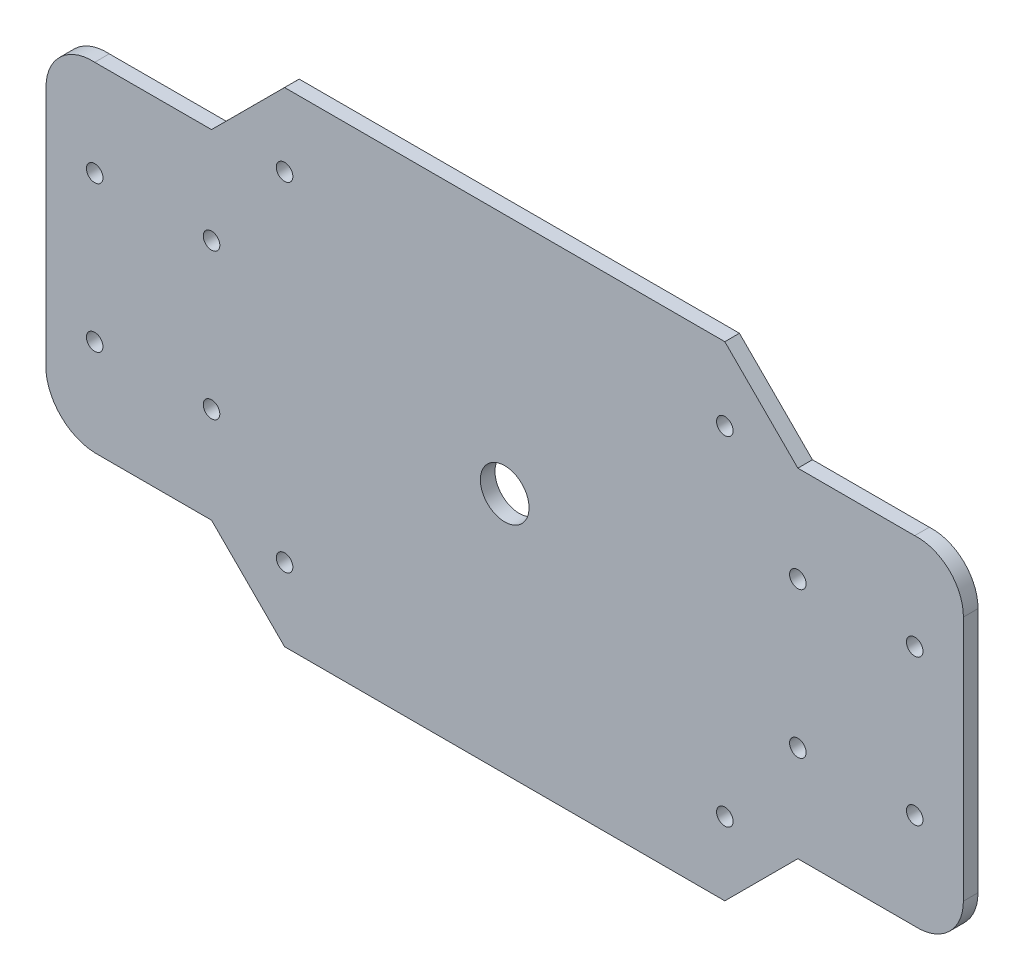
ISO-10303-21;
HEADER;
FILE_DESCRIPTION(('STEP AP214'),'2;1');
FILE_NAME('part.step','',(''),(''),'','','');
FILE_SCHEMA(('AUTOMOTIVE_DESIGN { 1 0 10303 214 1 1 1 1 }'));
ENDSEC;
DATA;
#1=APPLICATION_CONTEXT('core data for automotive mechanical design processes');
#2=APPLICATION_PROTOCOL_DEFINITION('international standard','automotive_design',2000,#1);
#3=PRODUCT_CONTEXT('',#1,'mechanical');
#4=PRODUCT('Part','Part','',(#3));
#5=PRODUCT_RELATED_PRODUCT_CATEGORY('part','',(#4));
#6=PRODUCT_DEFINITION_FORMATION('','',#4);
#7=PRODUCT_DEFINITION_CONTEXT('part definition',#1,'design');
#8=PRODUCT_DEFINITION('design','',#6,#7);
#9=PRODUCT_DEFINITION_SHAPE('','',#8);
#10=(LENGTH_UNIT() NAMED_UNIT(*) SI_UNIT(.MILLI.,.METRE.));
#11=(NAMED_UNIT(*) PLANE_ANGLE_UNIT() SI_UNIT($,.RADIAN.));
#12=(NAMED_UNIT(*) SI_UNIT($,.STERADIAN.) SOLID_ANGLE_UNIT());
#13=UNCERTAINTY_MEASURE_WITH_UNIT(LENGTH_MEASURE(1.E-05),#10,'distance_accuracy_value','');
#14=(GEOMETRIC_REPRESENTATION_CONTEXT(3) GLOBAL_UNCERTAINTY_ASSIGNED_CONTEXT((#13)) GLOBAL_UNIT_ASSIGNED_CONTEXT((#10,
#11,#12)) REPRESENTATION_CONTEXT('',''));
#15=CARTESIAN_POINT('',(0.,0.,0.));
#16=DIRECTION('',(0.,0.,1.));
#17=DIRECTION('',(1.,0.,0.));
#18=AXIS2_PLACEMENT_3D('',#15,#16,#17);
#19=CARTESIAN_POINT('',(-73.9609484041655,-51.1693996308529,3.));
#20=DIRECTION('',(0.,0.,1.));
#21=DIRECTION('',(1.,0.,0.));
#22=AXIS2_PLACEMENT_3D('',#19,#20,#21);
#23=PLANE('',#22);
#24=CARTESIAN_POINT('',(56.0129001992124,-111.19307287149,3.));
#25=DIRECTION('',(0.,0.,1.));
#26=DIRECTION('',(1.,0.,0.));
#27=AXIS2_PLACEMENT_3D('',#24,#25,#26);
#28=CIRCLE('',#27,1.70000000003746);
#29=CARTESIAN_POINT('',(57.7129001992499,-111.19307287149,3.));
#30=VERTEX_POINT('',#29);
#31=EDGE_CURVE('E379',#30,#30,#28,.T.);
#32=ORIENTED_EDGE('',*,*,#31,.F.);
#33=EDGE_LOOP('',(#32));
#34=FACE_BOUND('',#33,.T.);
#35=CARTESIAN_POINT('',(-34.4110998007876,-41.7240728714904,3.));
#36=DIRECTION('',(0.,0.,1.));
#37=DIRECTION('',(1.,0.,0.));
#38=AXIS2_PLACEMENT_3D('',#35,#36,#37);
#39=CIRCLE('',#38,1.70000000004367);
#40=CARTESIAN_POINT('',(-32.7110998007439,-41.7240728714904,3.));
#41=VERTEX_POINT('',#40);
#42=EDGE_CURVE('E391',#41,#41,#39,.T.);
#43=ORIENTED_EDGE('',*,*,#42,.F.);
#44=EDGE_LOOP('',(#43));
#45=FACE_BOUND('',#44,.T.);
#46=CARTESIAN_POINT('',(71.0129001992124,-61.4585728714904,3.));
#47=DIRECTION('',(0.,0.,1.));
#48=DIRECTION('',(1.,0.,0.));
#49=AXIS2_PLACEMENT_3D('',#46,#47,#48);
#50=CIRCLE('',#49,1.70000000003744);
#51=CARTESIAN_POINT('',(72.7129001992498,-61.4585728714904,3.));
#52=VERTEX_POINT('',#51);
#53=EDGE_CURVE('E403',#52,#52,#50,.T.);
#54=ORIENTED_EDGE('',*,*,#53,.F.);
#55=EDGE_LOOP('',(#54));
#56=FACE_BOUND('',#55,.T.);
#57=CARTESIAN_POINT('',(71.0129001992124,-91.4585728714904,3.));
#58=DIRECTION('',(0.,0.,1.));
#59=DIRECTION('',(1.,0.,0.));
#60=AXIS2_PLACEMENT_3D('',#57,#58,#59);
#61=CIRCLE('',#60,1.70000000003744);
#62=CARTESIAN_POINT('',(72.7129001992498,-91.4585728714904,3.));
#63=VERTEX_POINT('',#62);
#64=EDGE_CURVE('E415',#63,#63,#61,.T.);
#65=ORIENTED_EDGE('',*,*,#64,.F.);
#66=EDGE_LOOP('',(#65));
#67=FACE_BOUND('',#66,.T.);
#68=CARTESIAN_POINT('',(-49.4110998007876,-91.4585728714904,3.));
#69=DIRECTION('',(0.,0.,1.));
#70=DIRECTION('',(1.,0.,0.));
#71=AXIS2_PLACEMENT_3D('',#68,#69,#70);
#72=CIRCLE('',#71,1.70000000004368);
#73=CARTESIAN_POINT('',(-47.711099800744,-91.4585728714904,3.));
#74=VERTEX_POINT('',#73);
#75=EDGE_CURVE('E427',#74,#74,#72,.T.);
#76=ORIENTED_EDGE('',*,*,#75,.F.);
#77=EDGE_LOOP('',(#76));
#78=FACE_BOUND('',#77,.T.);
#79=CARTESIAN_POINT('',(-73.4110998007876,-61.4585728714903,3.));
#80=DIRECTION('',(0.,0.,1.));
#81=DIRECTION('',(1.,0.,0.));
#82=AXIS2_PLACEMENT_3D('',#79,#80,#81);
#83=CIRCLE('',#82,1.70000000004367);
#84=CARTESIAN_POINT('',(-71.7110998007439,-61.4585728714903,3.));
#85=VERTEX_POINT('',#84);
#86=EDGE_CURVE('E439',#85,#85,#83,.T.);
#87=ORIENTED_EDGE('',*,*,#86,.F.);
#88=EDGE_LOOP('',(#87));
#89=FACE_BOUND('',#88,.T.);
#90=CARTESIAN_POINT('',(-73.9609484041655,-51.1693996308529,3.));
#91=DIRECTION('',(0.,0.,1.));
#92=DIRECTION('',(1.,0.,0.));
#93=AXIS2_PLACEMENT_3D('',#90,#91,#92);
#94=CIRCLE('',#93,9.45015420591884);
#95=CARTESIAN_POINT('',(-73.4110998007876,-41.7352552059987,3.));
#96=VERTEX_POINT('',#95);
#97=CARTESIAN_POINT('',(-83.4110998007876,-51.1621128918068,3.));
#98=VERTEX_POINT('',#97);
#99=EDGE_CURVE('E209',#96,#98,#94,.T.);
#100=ORIENTED_EDGE('',*,*,#99,.T.);
#101=DIRECTION('',(0.,-1.,0.));
#102=VECTOR('',#101,1.);
#103=CARTESIAN_POINT('',(-83.4110998007876,-51.1621128918068,3.));
#104=LINE('',#103,#102);
#105=CARTESIAN_POINT('',(-83.4110998007876,-101.747816457124,3.));
#106=VERTEX_POINT('',#105);
#107=EDGE_CURVE('E117',#98,#106,#104,.T.);
#108=ORIENTED_EDGE('',*,*,#107,.T.);
#109=CARTESIAN_POINT('',(-72.9534173033831,-100.692218793061,3.));
#110=DIRECTION('',(0.,0.,1.));
#111=DIRECTION('',(1.,0.,0.));
#112=AXIS2_PLACEMENT_3D('',#109,#110,#111);
#113=CIRCLE('',#112,10.5108234522751);
#114=CARTESIAN_POINT('',(-73.4110998007876,-111.19307287149,3.));
#115=VERTEX_POINT('',#114);
#116=EDGE_CURVE('E248',#106,#115,#113,.T.);
#117=ORIENTED_EDGE('',*,*,#116,.T.);
#118=DIRECTION('',(1.,0.,0.));
#119=VECTOR('',#118,1.);
#120=CARTESIAN_POINT('',(-73.4110998007876,-111.19307287149,3.));
#121=LINE('',#120,#119);
#122=CARTESIAN_POINT('',(-49.4110998007876,-111.19307287149,3.));
#123=VERTEX_POINT('',#122);
#124=EDGE_CURVE('E267',#115,#123,#121,.T.);
#125=ORIENTED_EDGE('',*,*,#124,.T.);
#126=DIRECTION('',(0.707106781186547,-0.707106781186548,0.));
#127=VECTOR('',#126,1.);
#128=CARTESIAN_POINT('',(-49.4110998007876,-111.19307287149,3.));
#129=LINE('',#128,#127);
#130=CARTESIAN_POINT('',(-34.4110998007876,-126.19307287149,3.));
#131=VERTEX_POINT('',#130);
#132=EDGE_CURVE('E264',#123,#131,#129,.T.);
#133=ORIENTED_EDGE('',*,*,#132,.T.);
#134=DIRECTION('',(1.,0.,0.));
#135=VECTOR('',#134,1.);
#136=CARTESIAN_POINT('',(-34.4110998007876,-126.19307287149,3.));
#137=LINE('',#136,#135);
#138=CARTESIAN_POINT('',(56.0129001992124,-126.19307287149,3.));
#139=VERTEX_POINT('',#138);
#140=EDGE_CURVE('E266',#131,#139,#137,.T.);
#141=ORIENTED_EDGE('',*,*,#140,.T.);
#142=DIRECTION('',(0.707106781186547,0.707106781186548,0.));
#143=VECTOR('',#142,1.);
#144=CARTESIAN_POINT('',(56.0129001992124,-126.19307287149,3.));
#145=LINE('',#144,#143);
#146=CARTESIAN_POINT('',(71.0129001992124,-111.19307287149,3.));
#147=VERTEX_POINT('',#146);
#148=EDGE_CURVE('E269',#139,#147,#145,.T.);
#149=ORIENTED_EDGE('',*,*,#148,.T.);
#150=DIRECTION('',(1.,0.,0.));
#151=VECTOR('',#150,1.);
#152=CARTESIAN_POINT('',(71.0129001992124,-111.19307287149,3.));
#153=LINE('',#152,#151);
#154=CARTESIAN_POINT('',(95.0129001992124,-111.19307287149,3.));
#155=VERTEX_POINT('',#154);
#156=EDGE_CURVE('E275',#147,#155,#153,.T.);
#157=ORIENTED_EDGE('',*,*,#156,.T.);
#158=CARTESIAN_POINT('',(95.5591068848304,-101.758716890702,3.));
#159=DIRECTION('',(0.,0.,1.));
#160=DIRECTION('',(1.,0.,0.));
#161=AXIS2_PLACEMENT_3D('',#158,#159,#160);
#162=CIRCLE('',#161,9.45015420591886);
#163=CARTESIAN_POINT('',(105.009259778172,-101.753736115553,3.));
#164=VERTEX_POINT('',#163);
#165=EDGE_CURVE('E277',#155,#164,#162,.T.);
#166=ORIENTED_EDGE('',*,*,#165,.T.);
#167=DIRECTION('',(9.03448836990268E-05,0.999999995918901,0.));
#168=VECTOR('',#167,1.);
#169=CARTESIAN_POINT('',(105.013826090519,-51.2106157786757,3.));
#170=LINE('',#169,#168);
#171=CARTESIAN_POINT('',(105.013826090519,-51.2106157786757,3.));
#172=VERTEX_POINT('',#171);
#173=EDGE_CURVE('E279',#164,#172,#170,.T.);
#174=ORIENTED_EDGE('',*,*,#173,.T.);
#175=CARTESIAN_POINT('',(95.5638174991476,-51.1581549489518,3.));
#176=DIRECTION('',(0.,0.,1.));
#177=DIRECTION('',(1.,0.,0.));
#178=AXIS2_PLACEMENT_3D('',#175,#176,#177);
#179=CIRCLE('',#178,9.45015420591887);
#180=CARTESIAN_POINT('',(95.0129001992124,-41.7240728714904,3.));
#181=VERTEX_POINT('',#180);
#182=EDGE_CURVE('E281',#172,#181,#179,.T.);
#183=ORIENTED_EDGE('',*,*,#182,.T.);
#184=DIRECTION('',(-1.,0.,0.));
#185=VECTOR('',#184,1.);
#186=CARTESIAN_POINT('',(71.0129001992124,-41.7240728714904,3.));
#187=LINE('',#186,#185);
#188=CARTESIAN_POINT('',(71.0129001992124,-41.7240728714904,3.));
#189=VERTEX_POINT('',#188);
#190=EDGE_CURVE('E283',#181,#189,#187,.T.);
#191=ORIENTED_EDGE('',*,*,#190,.T.);
#192=DIRECTION('',(-0.707106781186548,0.707106781186547,0.));
#193=VECTOR('',#192,1.);
#194=CARTESIAN_POINT('',(56.0129001992124,-26.7240728714904,3.));
#195=LINE('',#194,#193);
#196=CARTESIAN_POINT('',(56.0129001992124,-26.7240728714904,3.));
#197=VERTEX_POINT('',#196);
#198=EDGE_CURVE('E160',#189,#197,#195,.T.);
#199=ORIENTED_EDGE('',*,*,#198,.T.);
#200=DIRECTION('',(-1.,0.,0.));
#201=VECTOR('',#200,1.);
#202=CARTESIAN_POINT('',(-34.4110998007876,-26.7240728714904,3.));
#203=LINE('',#202,#201);
#204=CARTESIAN_POINT('',(-34.4110998007876,-26.7240728714904,3.));
#205=VERTEX_POINT('',#204);
#206=EDGE_CURVE('E154',#197,#205,#203,.T.);
#207=ORIENTED_EDGE('',*,*,#206,.T.);
#208=DIRECTION('',(-0.707370400442388,-0.706843063613116,0.));
#209=VECTOR('',#208,1.);
#210=CARTESIAN_POINT('',(-49.4110998007876,-41.712890536982,3.));
#211=LINE('',#210,#209);
#212=CARTESIAN_POINT('',(-49.4110998007876,-41.712890536982,3.));
#213=VERTEX_POINT('',#212);
#214=EDGE_CURVE('E158',#205,#213,#211,.T.);
#215=ORIENTED_EDGE('',*,*,#214,.T.);
#216=DIRECTION('',(-0.999999565817626,-0.000931860804429724,0.));
#217=VECTOR('',#216,1.);
#218=CARTESIAN_POINT('',(-73.4110998007876,-41.7352552059987,3.));
#219=LINE('',#218,#217);
#220=EDGE_CURVE('E50',#213,#96,#219,.T.);
#221=ORIENTED_EDGE('',*,*,#220,.T.);
#222=EDGE_LOOP('',(#100,#108,#117,#125,#133,#141,#149,#157,#166,#174,#183,#191,#199,#207,#215,#221));
#223=FACE_BOUND('',#222,.T.);
#224=CARTESIAN_POINT('',(-49.4110998007876,-61.4585728714904,3.));
#225=DIRECTION('',(0.,0.,1.));
#226=DIRECTION('',(1.,0.,0.));
#227=AXIS2_PLACEMENT_3D('',#224,#225,#226);
#228=CIRCLE('',#227,1.7000000000437);
#229=CARTESIAN_POINT('',(-47.7110998007439,-61.4585728714904,3.));
#230=VERTEX_POINT('',#229);
#231=EDGE_CURVE('E182',#230,#230,#228,.T.);
#232=ORIENTED_EDGE('',*,*,#231,.F.);
#233=EDGE_LOOP('',(#232));
#234=FACE_BOUND('',#233,.T.);
#235=CARTESIAN_POINT('',(-73.4110998007876,-91.4585728714904,3.));
#236=DIRECTION('',(0.,0.,1.));
#237=DIRECTION('',(1.,0.,0.));
#238=AXIS2_PLACEMENT_3D('',#235,#236,#237);
#239=CIRCLE('',#238,1.70000000004367);
#240=CARTESIAN_POINT('',(-71.711099800744,-91.4585728714904,3.));
#241=VERTEX_POINT('',#240);
#242=EDGE_CURVE('E433',#241,#241,#239,.T.);
#243=ORIENTED_EDGE('',*,*,#242,.F.);
#244=EDGE_LOOP('',(#243));
#245=FACE_BOUND('',#244,.T.);
#246=CARTESIAN_POINT('',(95.0129001992124,-91.4585728714904,3.));
#247=DIRECTION('',(0.,0.,1.));
#248=DIRECTION('',(1.,0.,0.));
#249=AXIS2_PLACEMENT_3D('',#246,#247,#248);
#250=CIRCLE('',#249,1.70000000003744);
#251=CARTESIAN_POINT('',(96.7129001992498,-91.4585728714904,3.));
#252=VERTEX_POINT('',#251);
#253=EDGE_CURVE('E421',#252,#252,#250,.T.);
#254=ORIENTED_EDGE('',*,*,#253,.F.);
#255=EDGE_LOOP('',(#254));
#256=FACE_BOUND('',#255,.T.);
#257=CARTESIAN_POINT('',(95.0129001992124,-61.4585728714904,3.));
#258=DIRECTION('',(0.,0.,1.));
#259=DIRECTION('',(1.,0.,0.));
#260=AXIS2_PLACEMENT_3D('',#257,#258,#259);
#261=CIRCLE('',#260,1.70000000003744);
#262=CARTESIAN_POINT('',(96.7129001992498,-61.4585728714904,3.));
#263=VERTEX_POINT('',#262);
#264=EDGE_CURVE('E409',#263,#263,#261,.T.);
#265=ORIENTED_EDGE('',*,*,#264,.F.);
#266=EDGE_LOOP('',(#265));
#267=FACE_BOUND('',#266,.T.);
#268=CARTESIAN_POINT('',(10.8009001992124,-76.3830420823452,3.));
#269=DIRECTION('',(0.,0.,1.));
#270=DIRECTION('',(1.,0.,0.));
#271=AXIS2_PLACEMENT_3D('',#268,#269,#270);
#272=CIRCLE('',#271,5.00000000001872);
#273=CARTESIAN_POINT('',(15.8009001992311,-76.3830420823452,3.));
#274=VERTEX_POINT('',#273);
#275=EDGE_CURVE('E397',#274,#274,#272,.T.);
#276=ORIENTED_EDGE('',*,*,#275,.F.);
#277=EDGE_LOOP('',(#276));
#278=FACE_BOUND('',#277,.T.);
#279=CARTESIAN_POINT('',(-34.4110998007876,-111.19307287149,3.));
#280=DIRECTION('',(0.,0.,1.));
#281=DIRECTION('',(1.,0.,0.));
#282=AXIS2_PLACEMENT_3D('',#279,#280,#281);
#283=CIRCLE('',#282,1.70000000003746);
#284=CARTESIAN_POINT('',(-32.7110998007501,-111.19307287149,3.));
#285=VERTEX_POINT('',#284);
#286=EDGE_CURVE('E385',#285,#285,#283,.T.);
#287=ORIENTED_EDGE('',*,*,#286,.F.);
#288=EDGE_LOOP('',(#287));
#289=FACE_BOUND('',#288,.T.);
#290=CARTESIAN_POINT('',(56.0129001992124,-41.7240728714904,3.));
#291=DIRECTION('',(0.,0.,1.));
#292=DIRECTION('',(1.,0.,0.));
#293=AXIS2_PLACEMENT_3D('',#290,#291,#292);
#294=CIRCLE('',#293,1.70000000004366);
#295=CARTESIAN_POINT('',(57.7129001992561,-41.7240728714904,3.));
#296=VERTEX_POINT('',#295);
#297=EDGE_CURVE('E370',#296,#296,#294,.T.);
#298=ORIENTED_EDGE('',*,*,#297,.F.);
#299=EDGE_LOOP('',(#298));
#300=FACE_BOUND('',#299,.T.);
#301=ADVANCED_FACE('F33',(#34,#45,#56,#67,#78,#89,#223,#234,#245,#256,#267,#278,#289,#300),#23,.T.);
#302=CARTESIAN_POINT('',(-73.9609484041655,-51.1693996308529,0.));
#303=DIRECTION('',(0.,0.,1.));
#304=DIRECTION('',(1.,0.,0.));
#305=AXIS2_PLACEMENT_3D('',#302,#303,#304);
#306=PLANE('',#305);
#307=CARTESIAN_POINT('',(-73.9609484041655,-51.1693996308529,0.));
#308=DIRECTION('',(0.,0.,1.));
#309=DIRECTION('',(1.,0.,0.));
#310=AXIS2_PLACEMENT_3D('',#307,#308,#309);
#311=CIRCLE('',#310,9.45015420591884);
#312=CARTESIAN_POINT('',(-73.4110998007876,-41.7352552059987,0.));
#313=VERTEX_POINT('',#312);
#314=CARTESIAN_POINT('',(-83.4110998007876,-51.1621128918068,0.));
#315=VERTEX_POINT('',#314);
#316=EDGE_CURVE('E178',#313,#315,#311,.T.);
#317=ORIENTED_EDGE('',*,*,#316,.F.);
#318=DIRECTION('',(-0.999999565817626,-0.000931860804429724,0.));
#319=VECTOR('',#318,1.);
#320=CARTESIAN_POINT('',(-73.4110998007876,-41.7352552059987,0.));
#321=LINE('',#320,#319);
#322=CARTESIAN_POINT('',(-49.4110998007876,-41.712890536982,0.));
#323=VERTEX_POINT('',#322);
#324=EDGE_CURVE('E109',#323,#313,#321,.T.);
#325=ORIENTED_EDGE('',*,*,#324,.F.);
#326=DIRECTION('',(-0.707370400442388,-0.706843063613116,0.));
#327=VECTOR('',#326,1.);
#328=CARTESIAN_POINT('',(-49.4110998007876,-41.712890536982,0.));
#329=LINE('',#328,#327);
#330=CARTESIAN_POINT('',(-34.4110998007876,-26.7240728714904,0.));
#331=VERTEX_POINT('',#330);
#332=EDGE_CURVE('E103',#331,#323,#329,.T.);
#333=ORIENTED_EDGE('',*,*,#332,.F.);
#334=DIRECTION('',(-1.,0.,0.));
#335=VECTOR('',#334,1.);
#336=CARTESIAN_POINT('',(-34.4110998007876,-26.7240728714904,0.));
#337=LINE('',#336,#335);
#338=CARTESIAN_POINT('',(56.0129001992124,-26.7240728714904,0.));
#339=VERTEX_POINT('',#338);
#340=EDGE_CURVE('E168',#339,#331,#337,.T.);
#341=ORIENTED_EDGE('',*,*,#340,.F.);
#342=DIRECTION('',(-0.707106781186548,0.707106781186547,0.));
#343=VECTOR('',#342,1.);
#344=CARTESIAN_POINT('',(56.0129001992124,-26.7240728714904,0.));
#345=LINE('',#344,#343);
#346=CARTESIAN_POINT('',(71.0129001992124,-41.7240728714904,0.));
#347=VERTEX_POINT('',#346);
#348=EDGE_CURVE('E204',#347,#339,#345,.T.);
#349=ORIENTED_EDGE('',*,*,#348,.F.);
#350=DIRECTION('',(-1.,0.,0.));
#351=VECTOR('',#350,1.);
#352=CARTESIAN_POINT('',(71.0129001992124,-41.7240728714904,0.));
#353=LINE('',#352,#351);
#354=CARTESIAN_POINT('',(95.0129001992124,-41.7240728714904,0.));
#355=VERTEX_POINT('',#354);
#356=EDGE_CURVE('E202',#355,#347,#353,.T.);
#357=ORIENTED_EDGE('',*,*,#356,.F.);
#358=CARTESIAN_POINT('',(95.5638174991476,-51.1581549489518,0.));
#359=DIRECTION('',(0.,0.,1.));
#360=DIRECTION('',(1.,0.,0.));
#361=AXIS2_PLACEMENT_3D('',#358,#359,#360);
#362=CIRCLE('',#361,9.45015420591887);
#363=CARTESIAN_POINT('',(105.013826090519,-51.2106157786757,0.));
#364=VERTEX_POINT('',#363);
#365=EDGE_CURVE('E200',#364,#355,#362,.T.);
#366=ORIENTED_EDGE('',*,*,#365,.F.);
#367=DIRECTION('',(9.03448836990268E-05,0.999999995918901,0.));
#368=VECTOR('',#367,1.);
#369=CARTESIAN_POINT('',(105.013826090519,-51.2106157786757,0.));
#370=LINE('',#369,#368);
#371=CARTESIAN_POINT('',(105.009259778172,-101.753736115553,0.));
#372=VERTEX_POINT('',#371);
#373=EDGE_CURVE('E198',#372,#364,#370,.T.);
#374=ORIENTED_EDGE('',*,*,#373,.F.);
#375=CARTESIAN_POINT('',(95.5591068848304,-101.758716890702,0.));
#376=DIRECTION('',(0.,0.,1.));
#377=DIRECTION('',(1.,0.,0.));
#378=AXIS2_PLACEMENT_3D('',#375,#376,#377);
#379=CIRCLE('',#378,9.45015420591886);
#380=CARTESIAN_POINT('',(95.0129001992124,-111.19307287149,0.));
#381=VERTEX_POINT('',#380);
#382=EDGE_CURVE('E196',#381,#372,#379,.T.);
#383=ORIENTED_EDGE('',*,*,#382,.F.);
#384=DIRECTION('',(1.,0.,0.));
#385=VECTOR('',#384,1.);
#386=CARTESIAN_POINT('',(71.0129001992124,-111.19307287149,0.));
#387=LINE('',#386,#385);
#388=CARTESIAN_POINT('',(71.0129001992124,-111.19307287149,0.));
#389=VERTEX_POINT('',#388);
#390=EDGE_CURVE('E194',#389,#381,#387,.T.);
#391=ORIENTED_EDGE('',*,*,#390,.F.);
#392=DIRECTION('',(0.707106781186547,0.707106781186548,0.));
#393=VECTOR('',#392,1.);
#394=CARTESIAN_POINT('',(56.0129001992124,-126.19307287149,0.));
#395=LINE('',#394,#393);
#396=CARTESIAN_POINT('',(56.0129001992124,-126.19307287149,0.));
#397=VERTEX_POINT('',#396);
#398=EDGE_CURVE('E192',#397,#389,#395,.T.);
#399=ORIENTED_EDGE('',*,*,#398,.F.);
#400=DIRECTION('',(1.,0.,0.));
#401=VECTOR('',#400,1.);
#402=CARTESIAN_POINT('',(-34.4110998007876,-126.19307287149,0.));
#403=LINE('',#402,#401);
#404=CARTESIAN_POINT('',(-34.4110998007876,-126.19307287149,0.));
#405=VERTEX_POINT('',#404);
#406=EDGE_CURVE('E190',#405,#397,#403,.T.);
#407=ORIENTED_EDGE('',*,*,#406,.F.);
#408=DIRECTION('',(0.707106781186547,-0.707106781186548,0.));
#409=VECTOR('',#408,1.);
#410=CARTESIAN_POINT('',(-49.4110998007876,-111.19307287149,0.));
#411=LINE('',#410,#409);
#412=CARTESIAN_POINT('',(-49.4110998007876,-111.19307287149,0.));
#413=VERTEX_POINT('',#412);
#414=EDGE_CURVE('E188',#413,#405,#411,.T.);
#415=ORIENTED_EDGE('',*,*,#414,.F.);
#416=DIRECTION('',(1.,0.,0.));
#417=VECTOR('',#416,1.);
#418=CARTESIAN_POINT('',(-73.4110998007876,-111.19307287149,0.));
#419=LINE('',#418,#417);
#420=CARTESIAN_POINT('',(-73.4110998007876,-111.19307287149,0.));
#421=VERTEX_POINT('',#420);
#422=EDGE_CURVE('E186',#421,#413,#419,.T.);
#423=ORIENTED_EDGE('',*,*,#422,.F.);
#424=CARTESIAN_POINT('',(-72.9534173033831,-100.692218793061,0.));
#425=DIRECTION('',(0.,0.,1.));
#426=DIRECTION('',(1.,0.,0.));
#427=AXIS2_PLACEMENT_3D('',#424,#425,#426);
#428=CIRCLE('',#427,10.5108234522751);
#429=CARTESIAN_POINT('',(-83.4110998007876,-101.747816457124,0.));
#430=VERTEX_POINT('',#429);
#431=EDGE_CURVE('E184',#430,#421,#428,.T.);
#432=ORIENTED_EDGE('',*,*,#431,.F.);
#433=DIRECTION('',(0.,-1.,0.));
#434=VECTOR('',#433,1.);
#435=CARTESIAN_POINT('',(-83.4110998007876,-51.1621128918068,0.));
#436=LINE('',#435,#434);
#437=EDGE_CURVE('E181',#315,#430,#436,.T.);
#438=ORIENTED_EDGE('',*,*,#437,.F.);
#439=EDGE_LOOP('',(#317,#325,#333,#341,#349,#357,#366,#374,#383,#391,#399,#407,#415,#423,#432,#438));
#440=FACE_BOUND('',#439,.T.);
#441=CARTESIAN_POINT('',(-49.4110998007876,-61.4585728714904,0.));
#442=DIRECTION('',(0.,0.,1.));
#443=DIRECTION('',(1.,0.,0.));
#444=AXIS2_PLACEMENT_3D('',#441,#442,#443);
#445=CIRCLE('',#444,1.7000000000437);
#446=CARTESIAN_POINT('',(-47.7110998007439,-61.4585728714904,0.));
#447=VERTEX_POINT('',#446);
#448=EDGE_CURVE('E442',#447,#447,#445,.T.);
#449=ORIENTED_EDGE('',*,*,#448,.T.);
#450=EDGE_LOOP('',(#449));
#451=FACE_BOUND('',#450,.T.);
#452=CARTESIAN_POINT('',(-73.4110998007876,-61.4585728714903,0.));
#453=DIRECTION('',(0.,0.,1.));
#454=DIRECTION('',(1.,0.,0.));
#455=AXIS2_PLACEMENT_3D('',#452,#453,#454);
#456=CIRCLE('',#455,1.70000000004367);
#457=CARTESIAN_POINT('',(-71.7110998007439,-61.4585728714903,0.));
#458=VERTEX_POINT('',#457);
#459=EDGE_CURVE('E436',#458,#458,#456,.T.);
#460=ORIENTED_EDGE('',*,*,#459,.T.);
#461=EDGE_LOOP('',(#460));
#462=FACE_BOUND('',#461,.T.);
#463=CARTESIAN_POINT('',(-73.4110998007876,-91.4585728714904,0.));
#464=DIRECTION('',(0.,0.,1.));
#465=DIRECTION('',(1.,0.,0.));
#466=AXIS2_PLACEMENT_3D('',#463,#464,#465);
#467=CIRCLE('',#466,1.70000000004367);
#468=CARTESIAN_POINT('',(-71.711099800744,-91.4585728714904,0.));
#469=VERTEX_POINT('',#468);
#470=EDGE_CURVE('E430',#469,#469,#467,.T.);
#471=ORIENTED_EDGE('',*,*,#470,.T.);
#472=EDGE_LOOP('',(#471));
#473=FACE_BOUND('',#472,.T.);
#474=CARTESIAN_POINT('',(-49.4110998007876,-91.4585728714904,0.));
#475=DIRECTION('',(0.,0.,1.));
#476=DIRECTION('',(1.,0.,0.));
#477=AXIS2_PLACEMENT_3D('',#474,#475,#476);
#478=CIRCLE('',#477,1.70000000004368);
#479=CARTESIAN_POINT('',(-47.711099800744,-91.4585728714904,0.));
#480=VERTEX_POINT('',#479);
#481=EDGE_CURVE('E424',#480,#480,#478,.T.);
#482=ORIENTED_EDGE('',*,*,#481,.T.);
#483=EDGE_LOOP('',(#482));
#484=FACE_BOUND('',#483,.T.);
#485=CARTESIAN_POINT('',(95.0129001992124,-91.4585728714904,0.));
#486=DIRECTION('',(0.,0.,1.));
#487=DIRECTION('',(1.,0.,0.));
#488=AXIS2_PLACEMENT_3D('',#485,#486,#487);
#489=CIRCLE('',#488,1.70000000003744);
#490=CARTESIAN_POINT('',(96.7129001992498,-91.4585728714904,0.));
#491=VERTEX_POINT('',#490);
#492=EDGE_CURVE('E418',#491,#491,#489,.T.);
#493=ORIENTED_EDGE('',*,*,#492,.T.);
#494=EDGE_LOOP('',(#493));
#495=FACE_BOUND('',#494,.T.);
#496=CARTESIAN_POINT('',(71.0129001992124,-91.4585728714904,0.));
#497=DIRECTION('',(0.,0.,1.));
#498=DIRECTION('',(1.,0.,0.));
#499=AXIS2_PLACEMENT_3D('',#496,#497,#498);
#500=CIRCLE('',#499,1.70000000003744);
#501=CARTESIAN_POINT('',(72.7129001992498,-91.4585728714904,0.));
#502=VERTEX_POINT('',#501);
#503=EDGE_CURVE('E412',#502,#502,#500,.T.);
#504=ORIENTED_EDGE('',*,*,#503,.T.);
#505=EDGE_LOOP('',(#504));
#506=FACE_BOUND('',#505,.T.);
#507=CARTESIAN_POINT('',(95.0129001992124,-61.4585728714904,0.));
#508=DIRECTION('',(0.,0.,1.));
#509=DIRECTION('',(1.,0.,0.));
#510=AXIS2_PLACEMENT_3D('',#507,#508,#509);
#511=CIRCLE('',#510,1.70000000003744);
#512=CARTESIAN_POINT('',(96.7129001992498,-61.4585728714904,0.));
#513=VERTEX_POINT('',#512);
#514=EDGE_CURVE('E406',#513,#513,#511,.T.);
#515=ORIENTED_EDGE('',*,*,#514,.T.);
#516=EDGE_LOOP('',(#515));
#517=FACE_BOUND('',#516,.T.);
#518=CARTESIAN_POINT('',(71.0129001992124,-61.4585728714904,0.));
#519=DIRECTION('',(0.,0.,1.));
#520=DIRECTION('',(1.,0.,0.));
#521=AXIS2_PLACEMENT_3D('',#518,#519,#520);
#522=CIRCLE('',#521,1.70000000003744);
#523=CARTESIAN_POINT('',(72.7129001992498,-61.4585728714904,0.));
#524=VERTEX_POINT('',#523);
#525=EDGE_CURVE('E400',#524,#524,#522,.T.);
#526=ORIENTED_EDGE('',*,*,#525,.T.);
#527=EDGE_LOOP('',(#526));
#528=FACE_BOUND('',#527,.T.);
#529=CARTESIAN_POINT('',(10.8009001992124,-76.3830420823452,0.));
#530=DIRECTION('',(0.,0.,1.));
#531=DIRECTION('',(1.,0.,0.));
#532=AXIS2_PLACEMENT_3D('',#529,#530,#531);
#533=CIRCLE('',#532,5.00000000001872);
#534=CARTESIAN_POINT('',(15.8009001992311,-76.3830420823452,0.));
#535=VERTEX_POINT('',#534);
#536=EDGE_CURVE('E394',#535,#535,#533,.T.);
#537=ORIENTED_EDGE('',*,*,#536,.T.);
#538=EDGE_LOOP('',(#537));
#539=FACE_BOUND('',#538,.T.);
#540=CARTESIAN_POINT('',(-34.4110998007876,-41.7240728714904,0.));
#541=DIRECTION('',(0.,0.,1.));
#542=DIRECTION('',(1.,0.,0.));
#543=AXIS2_PLACEMENT_3D('',#540,#541,#542);
#544=CIRCLE('',#543,1.70000000004367);
#545=CARTESIAN_POINT('',(-32.7110998007439,-41.7240728714904,0.));
#546=VERTEX_POINT('',#545);
#547=EDGE_CURVE('E388',#546,#546,#544,.T.);
#548=ORIENTED_EDGE('',*,*,#547,.T.);
#549=EDGE_LOOP('',(#548));
#550=FACE_BOUND('',#549,.T.);
#551=CARTESIAN_POINT('',(-34.4110998007876,-111.19307287149,0.));
#552=DIRECTION('',(0.,0.,1.));
#553=DIRECTION('',(1.,0.,0.));
#554=AXIS2_PLACEMENT_3D('',#551,#552,#553);
#555=CIRCLE('',#554,1.70000000003746);
#556=CARTESIAN_POINT('',(-32.7110998007501,-111.19307287149,0.));
#557=VERTEX_POINT('',#556);
#558=EDGE_CURVE('E382',#557,#557,#555,.T.);
#559=ORIENTED_EDGE('',*,*,#558,.T.);
#560=EDGE_LOOP('',(#559));
#561=FACE_BOUND('',#560,.T.);
#562=CARTESIAN_POINT('',(56.0129001992124,-111.19307287149,0.));
#563=DIRECTION('',(0.,0.,1.));
#564=DIRECTION('',(1.,0.,0.));
#565=AXIS2_PLACEMENT_3D('',#562,#563,#564);
#566=CIRCLE('',#565,1.70000000003746);
#567=CARTESIAN_POINT('',(57.7129001992499,-111.19307287149,0.));
#568=VERTEX_POINT('',#567);
#569=EDGE_CURVE('E376',#568,#568,#566,.T.);
#570=ORIENTED_EDGE('',*,*,#569,.T.);
#571=EDGE_LOOP('',(#570));
#572=FACE_BOUND('',#571,.T.);
#573=CARTESIAN_POINT('',(56.0129001992124,-41.7240728714904,0.));
#574=DIRECTION('',(0.,0.,1.));
#575=DIRECTION('',(1.,0.,0.));
#576=AXIS2_PLACEMENT_3D('',#573,#574,#575);
#577=CIRCLE('',#576,1.70000000004366);
#578=CARTESIAN_POINT('',(57.7129001992561,-41.7240728714904,0.));
#579=VERTEX_POINT('',#578);
#580=EDGE_CURVE('E373',#579,#579,#577,.T.);
#581=ORIENTED_EDGE('',*,*,#580,.T.);
#582=EDGE_LOOP('',(#581));
#583=FACE_BOUND('',#582,.T.);
#584=ADVANCED_FACE('F252',(#440,#451,#462,#473,#484,#495,#506,#517,#528,#539,#550,#561,#572,
#583),#306,.F.);
#585=CARTESIAN_POINT('',(-73.9609484041655,-51.1693996308529,3.));
#586=DIRECTION('',(0.,0.,-1.));
#587=DIRECTION('',(-1.,0.,0.));
#588=AXIS2_PLACEMENT_3D('',#585,#586,#587);
#589=CYLINDRICAL_SURFACE('',#588,9.45015420591884);
#590=ORIENTED_EDGE('',*,*,#316,.T.);
#591=DIRECTION('',(0.,0.,-1.));
#592=VECTOR('',#591,1.);
#593=CARTESIAN_POINT('',(-83.4110998007876,-51.1621128918068,3.));
#594=LINE('',#593,#592);
#595=EDGE_CURVE('E11',#98,#315,#594,.T.);
#596=ORIENTED_EDGE('',*,*,#595,.F.);
#597=ORIENTED_EDGE('',*,*,#99,.F.);
#598=DIRECTION('',(0.,0.,-1.));
#599=VECTOR('',#598,1.);
#600=CARTESIAN_POINT('',(-73.4110998007876,-41.7352552059987,3.));
#601=LINE('',#600,#599);
#602=EDGE_CURVE('E174',#96,#313,#601,.T.);
#603=ORIENTED_EDGE('',*,*,#602,.T.);
#604=EDGE_LOOP('',(#590,#596,#597,#603));
#605=FACE_BOUND('',#604,.T.);
#606=ADVANCED_FACE('F35',(#605),#589,.T.);
#607=CARTESIAN_POINT('',(-83.4110998007876,-51.1621128918068,3.));
#608=DIRECTION('',(1.,0.,0.));
#609=DIRECTION('',(0.,1.,0.));
#610=AXIS2_PLACEMENT_3D('',#607,#608,#609);
#611=PLANE('',#610);
#612=ORIENTED_EDGE('',*,*,#437,.T.);
#613=DIRECTION('',(0.,0.,-1.));
#614=VECTOR('',#613,1.);
#615=CARTESIAN_POINT('',(-83.4110998007876,-101.747816457124,3.));
#616=LINE('',#615,#614);
#617=EDGE_CURVE('E42',#106,#430,#616,.T.);
#618=ORIENTED_EDGE('',*,*,#617,.F.);
#619=ORIENTED_EDGE('',*,*,#107,.F.);
#620=ORIENTED_EDGE('',*,*,#595,.T.);
#621=EDGE_LOOP('',(#612,#618,#619,#620));
#622=FACE_BOUND('',#621,.T.);
#623=ADVANCED_FACE('F673',(#622),#611,.F.);
#624=CARTESIAN_POINT('',(-72.9534173033831,-100.692218793061,3.));
#625=DIRECTION('',(0.,0.,-1.));
#626=DIRECTION('',(-1.,0.,0.));
#627=AXIS2_PLACEMENT_3D('',#624,#625,#626);
#628=CYLINDRICAL_SURFACE('',#627,10.5108234522751);
#629=ORIENTED_EDGE('',*,*,#431,.T.);
#630=DIRECTION('',(0.,0.,-1.));
#631=VECTOR('',#630,1.);
#632=CARTESIAN_POINT('',(-73.4110998007876,-111.19307287149,3.));
#633=LINE('',#632,#631);
#634=EDGE_CURVE('E240',#115,#421,#633,.T.);
#635=ORIENTED_EDGE('',*,*,#634,.F.);
#636=ORIENTED_EDGE('',*,*,#116,.F.);
#637=ORIENTED_EDGE('',*,*,#617,.T.);
#638=EDGE_LOOP('',(#629,#635,#636,#637));
#639=FACE_BOUND('',#638,.T.);
#640=ADVANCED_FACE('F246',(#639),#628,.T.);
#641=CARTESIAN_POINT('',(-73.4110998007876,-111.19307287149,3.));
#642=DIRECTION('',(0.,1.,0.));
#643=DIRECTION('',(0.,0.,1.));
#644=AXIS2_PLACEMENT_3D('',#641,#642,#643);
#645=PLANE('',#644);
#646=ORIENTED_EDGE('',*,*,#422,.T.);
#647=DIRECTION('',(0.,0.,-1.));
#648=VECTOR('',#647,1.);
#649=CARTESIAN_POINT('',(-49.4110998007876,-111.19307287149,3.));
#650=LINE('',#649,#648);
#651=EDGE_CURVE('E237',#123,#413,#650,.T.);
#652=ORIENTED_EDGE('',*,*,#651,.F.);
#653=ORIENTED_EDGE('',*,*,#124,.F.);
#654=ORIENTED_EDGE('',*,*,#634,.T.);
#655=EDGE_LOOP('',(#646,#652,#653,#654));
#656=FACE_BOUND('',#655,.T.);
#657=ADVANCED_FACE('F258',(#656),#645,.F.);
#658=CARTESIAN_POINT('',(-49.4110998007876,-111.19307287149,3.));
#659=DIRECTION('',(0.707106781186548,0.707106781186547,0.));
#660=DIRECTION('',(-0.707106781186547,0.707106781186548,0.));
#661=AXIS2_PLACEMENT_3D('',#658,#659,#660);
#662=PLANE('',#661);
#663=ORIENTED_EDGE('',*,*,#414,.T.);
#664=DIRECTION('',(0.,0.,-1.));
#665=VECTOR('',#664,1.);
#666=CARTESIAN_POINT('',(-34.4110998007876,-126.19307287149,3.));
#667=LINE('',#666,#665);
#668=EDGE_CURVE('E234',#131,#405,#667,.T.);
#669=ORIENTED_EDGE('',*,*,#668,.F.);
#670=ORIENTED_EDGE('',*,*,#132,.F.);
#671=ORIENTED_EDGE('',*,*,#651,.T.);
#672=EDGE_LOOP('',(#663,#669,#670,#671));
#673=FACE_BOUND('',#672,.T.);
#674=ADVANCED_FACE('F262',(#673),#662,.F.);
#675=CARTESIAN_POINT('',(-34.4110998007876,-126.19307287149,3.));
#676=DIRECTION('',(0.,1.,0.));
#677=DIRECTION('',(-1.,0.,0.));
#678=AXIS2_PLACEMENT_3D('',#675,#676,#677);
#679=PLANE('',#678);
#680=ORIENTED_EDGE('',*,*,#406,.T.);
#681=DIRECTION('',(0.,0.,-1.));
#682=VECTOR('',#681,1.);
#683=CARTESIAN_POINT('',(56.0129001992124,-126.19307287149,3.));
#684=LINE('',#683,#682);
#685=EDGE_CURVE('E231',#139,#397,#684,.T.);
#686=ORIENTED_EDGE('',*,*,#685,.F.);
#687=ORIENTED_EDGE('',*,*,#140,.F.);
#688=ORIENTED_EDGE('',*,*,#668,.T.);
#689=EDGE_LOOP('',(#680,#686,#687,#688));
#690=FACE_BOUND('',#689,.T.);
#691=ADVANCED_FACE('F638',(#690),#679,.F.);
#692=CARTESIAN_POINT('',(56.0129001992124,-126.19307287149,3.));
#693=DIRECTION('',(-0.707106781186548,0.707106781186547,0.));
#694=DIRECTION('',(-0.707106781186547,-0.707106781186548,0.));
#695=AXIS2_PLACEMENT_3D('',#692,#693,#694);
#696=PLANE('',#695);
#697=ORIENTED_EDGE('',*,*,#398,.T.);
#698=DIRECTION('',(0.,0.,-1.));
#699=VECTOR('',#698,1.);
#700=CARTESIAN_POINT('',(71.0129001992124,-111.19307287149,3.));
#701=LINE('',#700,#699);
#702=EDGE_CURVE('E228',#147,#389,#701,.T.);
#703=ORIENTED_EDGE('',*,*,#702,.F.);
#704=ORIENTED_EDGE('',*,*,#148,.F.);
#705=ORIENTED_EDGE('',*,*,#685,.T.);
#706=EDGE_LOOP('',(#697,#703,#704,#705));
#707=FACE_BOUND('',#706,.T.);
#708=ADVANCED_FACE('F628',(#707),#696,.F.);
#709=CARTESIAN_POINT('',(71.0129001992124,-111.19307287149,3.));
#710=DIRECTION('',(0.,1.,0.));
#711=DIRECTION('',(0.,0.,1.));
#712=AXIS2_PLACEMENT_3D('',#709,#710,#711);
#713=PLANE('',#712);
#714=ORIENTED_EDGE('',*,*,#390,.T.);
#715=DIRECTION('',(0.,0.,-1.));
#716=VECTOR('',#715,1.);
#717=CARTESIAN_POINT('',(95.0129001992124,-111.19307287149,3.));
#718=LINE('',#717,#716);
#719=EDGE_CURVE('E225',#155,#381,#718,.T.);
#720=ORIENTED_EDGE('',*,*,#719,.F.);
#721=ORIENTED_EDGE('',*,*,#156,.F.);
#722=ORIENTED_EDGE('',*,*,#702,.T.);
#723=EDGE_LOOP('',(#714,#720,#721,#722));
#724=FACE_BOUND('',#723,.T.);
#725=ADVANCED_FACE('F618',(#724),#713,.F.);
#726=CARTESIAN_POINT('',(95.5591068848304,-101.758716890702,3.));
#727=DIRECTION('',(0.,0.,-1.));
#728=DIRECTION('',(-1.,0.,0.));
#729=AXIS2_PLACEMENT_3D('',#726,#727,#728);
#730=CYLINDRICAL_SURFACE('',#729,9.45015420591886);
#731=ORIENTED_EDGE('',*,*,#382,.T.);
#732=DIRECTION('',(0.,0.,-1.));
#733=VECTOR('',#732,1.);
#734=CARTESIAN_POINT('',(105.009259778172,-101.753736115553,3.));
#735=LINE('',#734,#733);
#736=EDGE_CURVE('E222',#164,#372,#735,.T.);
#737=ORIENTED_EDGE('',*,*,#736,.F.);
#738=ORIENTED_EDGE('',*,*,#165,.F.);
#739=ORIENTED_EDGE('',*,*,#719,.T.);
#740=EDGE_LOOP('',(#731,#737,#738,#739));
#741=FACE_BOUND('',#740,.T.);
#742=ADVANCED_FACE('F608',(#741),#730,.T.);
#743=CARTESIAN_POINT('',(105.013826090519,-51.2106157786757,3.));
#744=DIRECTION('',(-0.999999995918901,9.03448836990268E-05,0.));
#745=DIRECTION('',(-9.03448836990268E-05,-0.999999995918901,0.));
#746=AXIS2_PLACEMENT_3D('',#743,#744,#745);
#747=PLANE('',#746);
#748=ORIENTED_EDGE('',*,*,#373,.T.);
#749=DIRECTION('',(0.,0.,-1.));
#750=VECTOR('',#749,1.);
#751=CARTESIAN_POINT('',(105.013826090519,-51.2106157786757,3.));
#752=LINE('',#751,#750);
#753=EDGE_CURVE('E219',#172,#364,#752,.T.);
#754=ORIENTED_EDGE('',*,*,#753,.F.);
#755=ORIENTED_EDGE('',*,*,#173,.F.);
#756=ORIENTED_EDGE('',*,*,#736,.T.);
#757=EDGE_LOOP('',(#748,#754,#755,#756));
#758=FACE_BOUND('',#757,.T.);
#759=ADVANCED_FACE('F598',(#758),#747,.F.);
#760=CARTESIAN_POINT('',(95.5638174991476,-51.1581549489518,3.));
#761=DIRECTION('',(0.,0.,-1.));
#762=DIRECTION('',(-1.,0.,0.));
#763=AXIS2_PLACEMENT_3D('',#760,#761,#762);
#764=CYLINDRICAL_SURFACE('',#763,9.45015420591887);
#765=ORIENTED_EDGE('',*,*,#365,.T.);
#766=DIRECTION('',(0.,0.,-1.));
#767=VECTOR('',#766,1.);
#768=CARTESIAN_POINT('',(95.0129001992124,-41.7240728714904,3.));
#769=LINE('',#768,#767);
#770=EDGE_CURVE('E216',#181,#355,#769,.T.);
#771=ORIENTED_EDGE('',*,*,#770,.F.);
#772=ORIENTED_EDGE('',*,*,#182,.F.);
#773=ORIENTED_EDGE('',*,*,#753,.T.);
#774=EDGE_LOOP('',(#765,#771,#772,#773));
#775=FACE_BOUND('',#774,.T.);
#776=ADVANCED_FACE('F589',(#775),#764,.T.);
#777=CARTESIAN_POINT('',(71.0129001992124,-41.7240728714904,3.));
#778=DIRECTION('',(0.,-1.,0.));
#779=DIRECTION('',(1.,0.,0.));
#780=AXIS2_PLACEMENT_3D('',#777,#778,#779);
#781=PLANE('',#780);
#782=ORIENTED_EDGE('',*,*,#356,.T.);
#783=DIRECTION('',(0.,0.,-1.));
#784=VECTOR('',#783,1.);
#785=CARTESIAN_POINT('',(71.0129001992124,-41.7240728714904,3.));
#786=LINE('',#785,#784);
#787=EDGE_CURVE('E213',#189,#347,#786,.T.);
#788=ORIENTED_EDGE('',*,*,#787,.F.);
#789=ORIENTED_EDGE('',*,*,#190,.F.);
#790=ORIENTED_EDGE('',*,*,#770,.T.);
#791=EDGE_LOOP('',(#782,#788,#789,#790));
#792=FACE_BOUND('',#791,.T.);
#793=ADVANCED_FACE('F289',(#792),#781,.F.);
#794=CARTESIAN_POINT('',(56.0129001992124,-26.7240728714904,3.));
#795=DIRECTION('',(-0.707106781186547,-0.707106781186548,0.));
#796=DIRECTION('',(0.707106781186548,-0.707106781186547,0.));
#797=AXIS2_PLACEMENT_3D('',#794,#795,#796);
#798=PLANE('',#797);
#799=ORIENTED_EDGE('',*,*,#348,.T.);
#800=DIRECTION('',(0.,0.,-1.));
#801=VECTOR('',#800,1.);
#802=CARTESIAN_POINT('',(56.0129001992124,-26.7240728714904,3.));
#803=LINE('',#802,#801);
#804=EDGE_CURVE('E169',#197,#339,#803,.T.);
#805=ORIENTED_EDGE('',*,*,#804,.F.);
#806=ORIENTED_EDGE('',*,*,#198,.F.);
#807=ORIENTED_EDGE('',*,*,#787,.T.);
#808=EDGE_LOOP('',(#799,#805,#806,#807));
#809=FACE_BOUND('',#808,.T.);
#810=ADVANCED_FACE('F293',(#809),#798,.F.);
#811=CARTESIAN_POINT('',(-34.4110998007876,-26.7240728714904,3.));
#812=DIRECTION('',(0.,-1.,0.));
#813=DIRECTION('',(1.,0.,0.));
#814=AXIS2_PLACEMENT_3D('',#811,#812,#813);
#815=PLANE('',#814);
#816=ORIENTED_EDGE('',*,*,#340,.T.);
#817=DIRECTION('',(0.,0.,-1.));
#818=VECTOR('',#817,1.);
#819=CARTESIAN_POINT('',(-34.4110998007876,-26.7240728714904,3.));
#820=LINE('',#819,#818);
#821=EDGE_CURVE('E165',#205,#331,#820,.T.);
#822=ORIENTED_EDGE('',*,*,#821,.F.);
#823=ORIENTED_EDGE('',*,*,#206,.F.);
#824=ORIENTED_EDGE('',*,*,#804,.T.);
#825=EDGE_LOOP('',(#816,#822,#823,#824));
#826=FACE_BOUND('',#825,.T.);
#827=ADVANCED_FACE('F166',(#826),#815,.F.);
#828=CARTESIAN_POINT('',(-49.4110998007876,-41.712890536982,3.));
#829=DIRECTION('',(0.706843063613116,-0.707370400442388,0.));
#830=DIRECTION('',(0.707370400442388,0.706843063613116,0.));
#831=AXIS2_PLACEMENT_3D('',#828,#829,#830);
#832=PLANE('',#831);
#833=ORIENTED_EDGE('',*,*,#332,.T.);
#834=DIRECTION('',(0.,0.,-1.));
#835=VECTOR('',#834,1.);
#836=CARTESIAN_POINT('',(-49.4110998007876,-41.712890536982,3.));
#837=LINE('',#836,#835);
#838=EDGE_CURVE('E170',#213,#323,#837,.T.);
#839=ORIENTED_EDGE('',*,*,#838,.F.);
#840=ORIENTED_EDGE('',*,*,#214,.F.);
#841=ORIENTED_EDGE('',*,*,#821,.T.);
#842=EDGE_LOOP('',(#833,#839,#840,#841));
#843=FACE_BOUND('',#842,.T.);
#844=ADVANCED_FACE('F172',(#843),#832,.F.);
#845=CARTESIAN_POINT('',(-73.4110998007876,-41.7352552059987,3.));
#846=DIRECTION('',(0.000931860804429724,-0.999999565817626,0.));
#847=DIRECTION('',(0.999999565817626,0.000931860804429724,0.));
#848=AXIS2_PLACEMENT_3D('',#845,#846,#847);
#849=PLANE('',#848);
#850=ORIENTED_EDGE('',*,*,#324,.T.);
#851=ORIENTED_EDGE('',*,*,#602,.F.);
#852=ORIENTED_EDGE('',*,*,#220,.F.);
#853=ORIENTED_EDGE('',*,*,#838,.T.);
#854=EDGE_LOOP('',(#850,#851,#852,#853));
#855=FACE_BOUND('',#854,.T.);
#856=ADVANCED_FACE('F297',(#855),#849,.F.);
#857=CARTESIAN_POINT('',(-49.4110998007876,-61.4585728714904,3.));
#858=DIRECTION('',(0.,0.,-1.));
#859=DIRECTION('',(-1.,0.,0.));
#860=AXIS2_PLACEMENT_3D('',#857,#858,#859);
#861=CYLINDRICAL_SURFACE('',#860,1.7000000000437);
#862=ORIENTED_EDGE('',*,*,#231,.T.);
#863=EDGE_LOOP('',(#862));
#864=FACE_BOUND('',#863,.T.);
#865=ORIENTED_EDGE('',*,*,#448,.F.);
#866=EDGE_LOOP('',(#865));
#867=FACE_BOUND('',#866,.T.);
#868=ADVANCED_FACE('F299',(#864,#867),#861,.F.);
#869=CARTESIAN_POINT('',(-73.4110998007876,-61.4585728714903,3.));
#870=DIRECTION('',(0.,0.,-1.));
#871=DIRECTION('',(-1.,0.,0.));
#872=AXIS2_PLACEMENT_3D('',#869,#870,#871);
#873=CYLINDRICAL_SURFACE('',#872,1.70000000004367);
#874=ORIENTED_EDGE('',*,*,#86,.T.);
#875=EDGE_LOOP('',(#874));
#876=FACE_BOUND('',#875,.T.);
#877=ORIENTED_EDGE('',*,*,#459,.F.);
#878=EDGE_LOOP('',(#877));
#879=FACE_BOUND('',#878,.T.);
#880=ADVANCED_FACE('F305',(#876,#879),#873,.F.);
#881=CARTESIAN_POINT('',(-73.4110998007876,-91.4585728714904,3.));
#882=DIRECTION('',(0.,0.,-1.));
#883=DIRECTION('',(-1.,0.,0.));
#884=AXIS2_PLACEMENT_3D('',#881,#882,#883);
#885=CYLINDRICAL_SURFACE('',#884,1.70000000004367);
#886=ORIENTED_EDGE('',*,*,#242,.T.);
#887=EDGE_LOOP('',(#886));
#888=FACE_BOUND('',#887,.T.);
#889=ORIENTED_EDGE('',*,*,#470,.F.);
#890=EDGE_LOOP('',(#889));
#891=FACE_BOUND('',#890,.T.);
#892=ADVANCED_FACE('F321',(#888,#891),#885,.F.);
#893=CARTESIAN_POINT('',(-49.4110998007876,-91.4585728714904,3.));
#894=DIRECTION('',(0.,0.,-1.));
#895=DIRECTION('',(-1.,0.,0.));
#896=AXIS2_PLACEMENT_3D('',#893,#894,#895);
#897=CYLINDRICAL_SURFACE('',#896,1.70000000004368);
#898=ORIENTED_EDGE('',*,*,#75,.T.);
#899=EDGE_LOOP('',(#898));
#900=FACE_BOUND('',#899,.T.);
#901=ORIENTED_EDGE('',*,*,#481,.F.);
#902=EDGE_LOOP('',(#901));
#903=FACE_BOUND('',#902,.T.);
#904=ADVANCED_FACE('F325',(#900,#903),#897,.F.);
#905=CARTESIAN_POINT('',(95.0129001992124,-91.4585728714904,3.));
#906=DIRECTION('',(0.,0.,-1.));
#907=DIRECTION('',(-1.,0.,0.));
#908=AXIS2_PLACEMENT_3D('',#905,#906,#907);
#909=CYLINDRICAL_SURFACE('',#908,1.70000000003744);
#910=ORIENTED_EDGE('',*,*,#253,.T.);
#911=EDGE_LOOP('',(#910));
#912=FACE_BOUND('',#911,.T.);
#913=ORIENTED_EDGE('',*,*,#492,.F.);
#914=EDGE_LOOP('',(#913));
#915=FACE_BOUND('',#914,.T.);
#916=ADVANCED_FACE('F329',(#912,#915),#909,.F.);
#917=CARTESIAN_POINT('',(71.0129001992124,-91.4585728714904,3.));
#918=DIRECTION('',(0.,0.,-1.));
#919=DIRECTION('',(-1.,0.,0.));
#920=AXIS2_PLACEMENT_3D('',#917,#918,#919);
#921=CYLINDRICAL_SURFACE('',#920,1.70000000003744);
#922=ORIENTED_EDGE('',*,*,#64,.T.);
#923=EDGE_LOOP('',(#922));
#924=FACE_BOUND('',#923,.T.);
#925=ORIENTED_EDGE('',*,*,#503,.F.);
#926=EDGE_LOOP('',(#925));
#927=FACE_BOUND('',#926,.T.);
#928=ADVANCED_FACE('F333',(#924,#927),#921,.F.);
#929=CARTESIAN_POINT('',(95.0129001992124,-61.4585728714904,3.));
#930=DIRECTION('',(0.,0.,-1.));
#931=DIRECTION('',(-1.,0.,0.));
#932=AXIS2_PLACEMENT_3D('',#929,#930,#931);
#933=CYLINDRICAL_SURFACE('',#932,1.70000000003744);
#934=ORIENTED_EDGE('',*,*,#264,.T.);
#935=EDGE_LOOP('',(#934));
#936=FACE_BOUND('',#935,.T.);
#937=ORIENTED_EDGE('',*,*,#514,.F.);
#938=EDGE_LOOP('',(#937));
#939=FACE_BOUND('',#938,.T.);
#940=ADVANCED_FACE('F337',(#936,#939),#933,.F.);
#941=CARTESIAN_POINT('',(71.0129001992124,-61.4585728714904,3.));
#942=DIRECTION('',(0.,0.,-1.));
#943=DIRECTION('',(-1.,0.,0.));
#944=AXIS2_PLACEMENT_3D('',#941,#942,#943);
#945=CYLINDRICAL_SURFACE('',#944,1.70000000003744);
#946=ORIENTED_EDGE('',*,*,#53,.T.);
#947=EDGE_LOOP('',(#946));
#948=FACE_BOUND('',#947,.T.);
#949=ORIENTED_EDGE('',*,*,#525,.F.);
#950=EDGE_LOOP('',(#949));
#951=FACE_BOUND('',#950,.T.);
#952=ADVANCED_FACE('F341',(#948,#951),#945,.F.);
#953=CARTESIAN_POINT('',(10.8009001992124,-76.3830420823452,3.));
#954=DIRECTION('',(0.,0.,-1.));
#955=DIRECTION('',(-1.,0.,0.));
#956=AXIS2_PLACEMENT_3D('',#953,#954,#955);
#957=CYLINDRICAL_SURFACE('',#956,5.00000000001872);
#958=ORIENTED_EDGE('',*,*,#275,.T.);
#959=EDGE_LOOP('',(#958));
#960=FACE_BOUND('',#959,.T.);
#961=ORIENTED_EDGE('',*,*,#536,.F.);
#962=EDGE_LOOP('',(#961));
#963=FACE_BOUND('',#962,.T.);
#964=ADVANCED_FACE('F345',(#960,#963),#957,.F.);
#965=CARTESIAN_POINT('',(-34.4110998007876,-41.7240728714904,3.));
#966=DIRECTION('',(0.,0.,-1.));
#967=DIRECTION('',(-1.,0.,0.));
#968=AXIS2_PLACEMENT_3D('',#965,#966,#967);
#969=CYLINDRICAL_SURFACE('',#968,1.70000000004367);
#970=ORIENTED_EDGE('',*,*,#42,.T.);
#971=EDGE_LOOP('',(#970));
#972=FACE_BOUND('',#971,.T.);
#973=ORIENTED_EDGE('',*,*,#547,.F.);
#974=EDGE_LOOP('',(#973));
#975=FACE_BOUND('',#974,.T.);
#976=ADVANCED_FACE('F349',(#972,#975),#969,.F.);
#977=CARTESIAN_POINT('',(-34.4110998007876,-111.19307287149,3.));
#978=DIRECTION('',(0.,0.,-1.));
#979=DIRECTION('',(-1.,0.,0.));
#980=AXIS2_PLACEMENT_3D('',#977,#978,#979);
#981=CYLINDRICAL_SURFACE('',#980,1.70000000003746);
#982=ORIENTED_EDGE('',*,*,#286,.T.);
#983=EDGE_LOOP('',(#982));
#984=FACE_BOUND('',#983,.T.);
#985=ORIENTED_EDGE('',*,*,#558,.F.);
#986=EDGE_LOOP('',(#985));
#987=FACE_BOUND('',#986,.T.);
#988=ADVANCED_FACE('F353',(#984,#987),#981,.F.);
#989=CARTESIAN_POINT('',(56.0129001992124,-111.19307287149,3.));
#990=DIRECTION('',(0.,0.,-1.));
#991=DIRECTION('',(-1.,0.,0.));
#992=AXIS2_PLACEMENT_3D('',#989,#990,#991);
#993=CYLINDRICAL_SURFACE('',#992,1.70000000003746);
#994=ORIENTED_EDGE('',*,*,#31,.T.);
#995=EDGE_LOOP('',(#994));
#996=FACE_BOUND('',#995,.T.);
#997=ORIENTED_EDGE('',*,*,#569,.F.);
#998=EDGE_LOOP('',(#997));
#999=FACE_BOUND('',#998,.T.);
#1000=ADVANCED_FACE('F357',(#996,#999),#993,.F.);
#1001=CARTESIAN_POINT('',(56.0129001992124,-41.7240728714904,3.));
#1002=DIRECTION('',(0.,0.,-1.));
#1003=DIRECTION('',(-1.,0.,0.));
#1004=AXIS2_PLACEMENT_3D('',#1001,#1002,#1003);
#1005=CYLINDRICAL_SURFACE('',#1004,1.70000000004366);
#1006=ORIENTED_EDGE('',*,*,#297,.T.);
#1007=EDGE_LOOP('',(#1006));
#1008=FACE_BOUND('',#1007,.T.);
#1009=ORIENTED_EDGE('',*,*,#580,.F.);
#1010=EDGE_LOOP('',(#1009));
#1011=FACE_BOUND('',#1010,.T.);
#1012=ADVANCED_FACE('F361',(#1008,#1011),#1005,.F.);
#1013=CLOSED_SHELL('',(#301,#584,#606,#623,#640,#657,#674,#691,#708,#725,#742,#759,#776,#793,
#810,#827,#844,#856,#868,#880,#892,#904,#916,#928,#940,#952,#964,#976,#988,#1000,#1012));
#1014=MANIFOLD_SOLID_BREP('B2',#1013);
#1015=ADVANCED_BREP_SHAPE_REPRESENTATION('',(#18,#1014),#14);
#1016=SHAPE_DEFINITION_REPRESENTATION(#9,#1015);
ENDSEC;
END-ISO-10303-21;
